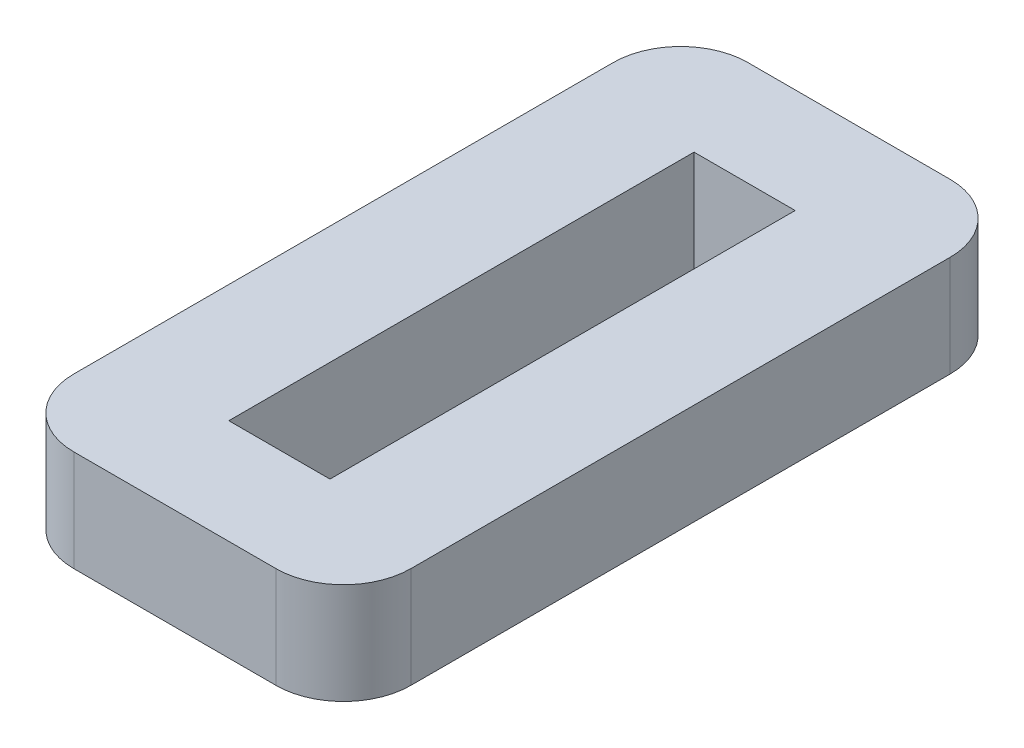
ISO-10303-21;
HEADER;
FILE_DESCRIPTION(('STEP AP214'),'2;1');
FILE_NAME('part.step','',(''),(''),'','','');
FILE_SCHEMA(('AUTOMOTIVE_DESIGN { 1 0 10303 214 1 1 1 1 }'));
ENDSEC;
DATA;
#1=APPLICATION_CONTEXT('core data for automotive mechanical design processes');
#2=APPLICATION_PROTOCOL_DEFINITION('international standard','automotive_design',2000,#1);
#3=PRODUCT_CONTEXT('',#1,'mechanical');
#4=PRODUCT('Part','Part','',(#3));
#5=PRODUCT_RELATED_PRODUCT_CATEGORY('part','',(#4));
#6=PRODUCT_DEFINITION_FORMATION('','',#4);
#7=PRODUCT_DEFINITION_CONTEXT('part definition',#1,'design');
#8=PRODUCT_DEFINITION('design','',#6,#7);
#9=PRODUCT_DEFINITION_SHAPE('','',#8);
#10=(LENGTH_UNIT() NAMED_UNIT(*) SI_UNIT(.MILLI.,.METRE.));
#11=(NAMED_UNIT(*) PLANE_ANGLE_UNIT() SI_UNIT($,.RADIAN.));
#12=(NAMED_UNIT(*) SI_UNIT($,.STERADIAN.) SOLID_ANGLE_UNIT());
#13=UNCERTAINTY_MEASURE_WITH_UNIT(LENGTH_MEASURE(1.E-05),#10,'distance_accuracy_value','');
#14=(GEOMETRIC_REPRESENTATION_CONTEXT(3) GLOBAL_UNCERTAINTY_ASSIGNED_CONTEXT((#13)) GLOBAL_UNIT_ASSIGNED_CONTEXT((#10,
#11,#12)) REPRESENTATION_CONTEXT('',''));
#15=CARTESIAN_POINT('',(0.,0.,0.));
#16=DIRECTION('',(0.,0.,1.));
#17=DIRECTION('',(1.,0.,0.));
#18=AXIS2_PLACEMENT_3D('',#15,#16,#17);
#19=CARTESIAN_POINT('',(5.,3.,10.));
#20=DIRECTION('',(-1.,0.,0.));
#21=DIRECTION('',(0.,0.,1.));
#22=AXIS2_PLACEMENT_3D('',#19,#20,#21);
#23=PLANE('',#22);
#24=DIRECTION('',(0.,0.,-1.));
#25=VECTOR('',#24,1.);
#26=CARTESIAN_POINT('',(5.,3.,10.));
#27=LINE('',#26,#25);
#28=CARTESIAN_POINT('',(5.,3.,8.));
#29=VERTEX_POINT('',#28);
#30=CARTESIAN_POINT('',(5.,3.,-8.));
#31=VERTEX_POINT('',#30);
#32=EDGE_CURVE('E170',#29,#31,#27,.T.);
#33=ORIENTED_EDGE('',*,*,#32,.F.);
#34=DIRECTION('',(0.,-1.,0.));
#35=VECTOR('',#34,1.);
#36=CARTESIAN_POINT('',(5.,3.,8.));
#37=LINE('',#36,#35);
#38=CARTESIAN_POINT('',(5.,0.,8.));
#39=VERTEX_POINT('',#38);
#40=EDGE_CURVE('E217',#29,#39,#37,.T.);
#41=ORIENTED_EDGE('',*,*,#40,.T.);
#42=DIRECTION('',(0.,0.,-1.));
#43=VECTOR('',#42,1.);
#44=CARTESIAN_POINT('',(5.,0.,10.));
#45=LINE('',#44,#43);
#46=CARTESIAN_POINT('',(5.,0.,-8.));
#47=VERTEX_POINT('',#46);
#48=EDGE_CURVE('E166',#39,#47,#45,.T.);
#49=ORIENTED_EDGE('',*,*,#48,.T.);
#50=DIRECTION('',(0.,-1.,0.));
#51=VECTOR('',#50,1.);
#52=CARTESIAN_POINT('',(5.,3.,-8.));
#53=LINE('',#52,#51);
#54=EDGE_CURVE('E215',#47,#31,#53,.F.);
#55=ORIENTED_EDGE('',*,*,#54,.T.);
#56=EDGE_LOOP('',(#33,#41,#49,#55));
#57=FACE_BOUND('',#56,.T.);
#58=ADVANCED_FACE('F36',(#57),#23,.F.);
#59=CARTESIAN_POINT('',(-5.,3.,-10.));
#60=DIRECTION('',(0.,0.,1.));
#61=DIRECTION('',(1.,0.,0.));
#62=AXIS2_PLACEMENT_3D('',#59,#60,#61);
#63=PLANE('',#62);
#64=DIRECTION('',(-1.,0.,0.));
#65=VECTOR('',#64,1.);
#66=CARTESIAN_POINT('',(-5.,3.,-10.));
#67=LINE('',#66,#65);
#68=CARTESIAN_POINT('',(3.,3.,-10.));
#69=VERTEX_POINT('',#68);
#70=CARTESIAN_POINT('',(-3.,3.,-10.));
#71=VERTEX_POINT('',#70);
#72=EDGE_CURVE('E172',#69,#71,#67,.T.);
#73=ORIENTED_EDGE('',*,*,#72,.F.);
#74=DIRECTION('',(0.,-1.,0.));
#75=VECTOR('',#74,1.);
#76=CARTESIAN_POINT('',(3.,3.,-10.));
#77=LINE('',#76,#75);
#78=CARTESIAN_POINT('',(3.,0.,-10.));
#79=VERTEX_POINT('',#78);
#80=EDGE_CURVE('E11',#69,#79,#77,.T.);
#81=ORIENTED_EDGE('',*,*,#80,.T.);
#82=DIRECTION('',(-1.,0.,0.));
#83=VECTOR('',#82,1.);
#84=CARTESIAN_POINT('',(-5.,0.,-10.));
#85=LINE('',#84,#83);
#86=CARTESIAN_POINT('',(-3.,0.,-10.));
#87=VERTEX_POINT('',#86);
#88=EDGE_CURVE('E184',#79,#87,#85,.T.);
#89=ORIENTED_EDGE('',*,*,#88,.T.);
#90=DIRECTION('',(0.,-1.,0.));
#91=VECTOR('',#90,1.);
#92=CARTESIAN_POINT('',(-3.,3.,-10.));
#93=LINE('',#92,#91);
#94=EDGE_CURVE('E44',#87,#71,#93,.F.);
#95=ORIENTED_EDGE('',*,*,#94,.T.);
#96=EDGE_LOOP('',(#73,#81,#89,#95));
#97=FACE_BOUND('',#96,.T.);
#98=ADVANCED_FACE('F231',(#97),#63,.F.);
#99=CARTESIAN_POINT('',(-5.,3.,10.));
#100=DIRECTION('',(1.,0.,0.));
#101=DIRECTION('',(0.,0.,-1.));
#102=AXIS2_PLACEMENT_3D('',#99,#100,#101);
#103=PLANE('',#102);
#104=DIRECTION('',(0.,0.,1.));
#105=VECTOR('',#104,1.);
#106=CARTESIAN_POINT('',(-5.,0.,10.));
#107=LINE('',#106,#105);
#108=CARTESIAN_POINT('',(-5.,0.,-8.));
#109=VERTEX_POINT('',#108);
#110=CARTESIAN_POINT('',(-5.,0.,8.));
#111=VERTEX_POINT('',#110);
#112=EDGE_CURVE('E186',#109,#111,#107,.T.);
#113=ORIENTED_EDGE('',*,*,#112,.T.);
#114=DIRECTION('',(0.,-1.,0.));
#115=VECTOR('',#114,1.);
#116=CARTESIAN_POINT('',(-5.,3.,8.));
#117=LINE('',#116,#115);
#118=CARTESIAN_POINT('',(-5.,3.,8.));
#119=VERTEX_POINT('',#118);
#120=EDGE_CURVE('E206',#111,#119,#117,.F.);
#121=ORIENTED_EDGE('',*,*,#120,.T.);
#122=DIRECTION('',(0.,0.,1.));
#123=VECTOR('',#122,1.);
#124=CARTESIAN_POINT('',(-5.,3.,10.));
#125=LINE('',#124,#123);
#126=CARTESIAN_POINT('',(-5.,3.,-8.));
#127=VERTEX_POINT('',#126);
#128=EDGE_CURVE('E175',#127,#119,#125,.T.);
#129=ORIENTED_EDGE('',*,*,#128,.F.);
#130=DIRECTION('',(0.,-1.,0.));
#131=VECTOR('',#130,1.);
#132=CARTESIAN_POINT('',(-5.,3.,-8.));
#133=LINE('',#132,#131);
#134=EDGE_CURVE('E203',#127,#109,#133,.T.);
#135=ORIENTED_EDGE('',*,*,#134,.T.);
#136=EDGE_LOOP('',(#113,#121,#129,#135));
#137=FACE_BOUND('',#136,.T.);
#138=ADVANCED_FACE('F239',(#137),#103,.F.);
#139=CARTESIAN_POINT('',(-5.,3.,10.));
#140=DIRECTION('',(0.,0.,-1.));
#141=DIRECTION('',(-1.,0.,0.));
#142=AXIS2_PLACEMENT_3D('',#139,#140,#141);
#143=PLANE('',#142);
#144=DIRECTION('',(1.,0.,0.));
#145=VECTOR('',#144,1.);
#146=CARTESIAN_POINT('',(-5.,3.,10.));
#147=LINE('',#146,#145);
#148=CARTESIAN_POINT('',(-3.,3.,10.));
#149=VERTEX_POINT('',#148);
#150=CARTESIAN_POINT('',(3.,3.,10.));
#151=VERTEX_POINT('',#150);
#152=EDGE_CURVE('E178',#149,#151,#147,.T.);
#153=ORIENTED_EDGE('',*,*,#152,.F.);
#154=DIRECTION('',(0.,-1.,0.));
#155=VECTOR('',#154,1.);
#156=CARTESIAN_POINT('',(-3.,3.,10.));
#157=LINE('',#156,#155);
#158=CARTESIAN_POINT('',(-3.,0.,10.));
#159=VERTEX_POINT('',#158);
#160=EDGE_CURVE('E192',#149,#159,#157,.T.);
#161=ORIENTED_EDGE('',*,*,#160,.T.);
#162=DIRECTION('',(1.,0.,0.));
#163=VECTOR('',#162,1.);
#164=CARTESIAN_POINT('',(-5.,0.,10.));
#165=LINE('',#164,#163);
#166=CARTESIAN_POINT('',(3.,0.,10.));
#167=VERTEX_POINT('',#166);
#168=EDGE_CURVE('E173',#159,#167,#165,.T.);
#169=ORIENTED_EDGE('',*,*,#168,.T.);
#170=DIRECTION('',(0.,-1.,0.));
#171=VECTOR('',#170,1.);
#172=CARTESIAN_POINT('',(3.,3.,10.));
#173=LINE('',#172,#171);
#174=EDGE_CURVE('E181',#167,#151,#173,.F.);
#175=ORIENTED_EDGE('',*,*,#174,.T.);
#176=EDGE_LOOP('',(#153,#161,#169,#175));
#177=FACE_BOUND('',#176,.T.);
#178=ADVANCED_FACE('F247',(#177),#143,.F.);
#179=CARTESIAN_POINT('',(0.,3.,0.));
#180=DIRECTION('',(0.,-1.,0.));
#181=DIRECTION('',(0.,0.,-1.));
#182=AXIS2_PLACEMENT_3D('',#179,#180,#181);
#183=PLANE('',#182);
#184=DIRECTION('',(-1.,0.,0.));
#185=VECTOR('',#184,1.);
#186=CARTESIAN_POINT('',(-1.5,3.,-6.9));
#187=LINE('',#186,#185);
#188=CARTESIAN_POINT('',(1.5,3.,-6.9));
#189=VERTEX_POINT('',#188);
#190=CARTESIAN_POINT('',(-1.5,3.,-6.9));
#191=VERTEX_POINT('',#190);
#192=EDGE_CURVE('E160',#189,#191,#187,.T.);
#193=ORIENTED_EDGE('',*,*,#192,.F.);
#194=DIRECTION('',(0.,0.,-1.));
#195=VECTOR('',#194,1.);
#196=CARTESIAN_POINT('',(1.5,3.,6.9));
#197=LINE('',#196,#195);
#198=CARTESIAN_POINT('',(1.5,3.,6.9));
#199=VERTEX_POINT('',#198);
#200=EDGE_CURVE('E133',#199,#189,#197,.T.);
#201=ORIENTED_EDGE('',*,*,#200,.F.);
#202=DIRECTION('',(1.,0.,0.));
#203=VECTOR('',#202,1.);
#204=CARTESIAN_POINT('',(-1.5,3.,6.9));
#205=LINE('',#204,#203);
#206=CARTESIAN_POINT('',(-1.5,3.,6.9));
#207=VERTEX_POINT('',#206);
#208=EDGE_CURVE('E151',#207,#199,#205,.T.);
#209=ORIENTED_EDGE('',*,*,#208,.F.);
#210=DIRECTION('',(0.,0.,1.));
#211=VECTOR('',#210,1.);
#212=CARTESIAN_POINT('',(-1.5,3.,6.9));
#213=LINE('',#212,#211);
#214=EDGE_CURVE('E154',#191,#207,#213,.T.);
#215=ORIENTED_EDGE('',*,*,#214,.F.);
#216=EDGE_LOOP('',(#193,#201,#209,#215));
#217=FACE_BOUND('',#216,.T.);
#218=ORIENTED_EDGE('',*,*,#128,.T.);
#219=CARTESIAN_POINT('',(-3.,3.,8.));
#220=DIRECTION('',(0.,-1.,0.));
#221=DIRECTION('',(0.,0.,-1.));
#222=AXIS2_PLACEMENT_3D('',#219,#220,#221);
#223=CIRCLE('',#222,2.);
#224=EDGE_CURVE('E213',#119,#149,#223,.F.);
#225=ORIENTED_EDGE('',*,*,#224,.T.);
#226=ORIENTED_EDGE('',*,*,#152,.T.);
#227=CARTESIAN_POINT('',(3.,3.,8.));
#228=DIRECTION('',(0.,-1.,0.));
#229=DIRECTION('',(0.,0.,-1.));
#230=AXIS2_PLACEMENT_3D('',#227,#228,#229);
#231=CIRCLE('',#230,2.);
#232=EDGE_CURVE('E211',#151,#29,#231,.F.);
#233=ORIENTED_EDGE('',*,*,#232,.T.);
#234=ORIENTED_EDGE('',*,*,#32,.T.);
#235=CARTESIAN_POINT('',(3.,3.,-8.));
#236=DIRECTION('',(0.,-1.,0.));
#237=DIRECTION('',(0.,0.,-1.));
#238=AXIS2_PLACEMENT_3D('',#235,#236,#237);
#239=CIRCLE('',#238,2.);
#240=EDGE_CURVE('E57',#31,#69,#239,.F.);
#241=ORIENTED_EDGE('',*,*,#240,.T.);
#242=ORIENTED_EDGE('',*,*,#72,.T.);
#243=CARTESIAN_POINT('',(-3.,3.,-8.));
#244=DIRECTION('',(0.,-1.,0.));
#245=DIRECTION('',(0.,0.,-1.));
#246=AXIS2_PLACEMENT_3D('',#243,#244,#245);
#247=CIRCLE('',#246,2.);
#248=EDGE_CURVE('E208',#71,#127,#247,.F.);
#249=ORIENTED_EDGE('',*,*,#248,.T.);
#250=EDGE_LOOP('',(#218,#225,#226,#233,#234,#241,#242,#249));
#251=FACE_BOUND('',#250,.T.);
#252=ADVANCED_FACE('F233',(#217,#251),#183,.F.);
#253=CARTESIAN_POINT('',(0.,0.,0.));
#254=DIRECTION('',(0.,-1.,0.));
#255=DIRECTION('',(0.,0.,-1.));
#256=AXIS2_PLACEMENT_3D('',#253,#254,#255);
#257=PLANE('',#256);
#258=DIRECTION('',(0.,0.,-1.));
#259=VECTOR('',#258,1.);
#260=CARTESIAN_POINT('',(1.5,0.,6.9));
#261=LINE('',#260,#259);
#262=CARTESIAN_POINT('',(1.5,0.,6.9));
#263=VERTEX_POINT('',#262);
#264=CARTESIAN_POINT('',(1.5,0.,-6.9));
#265=VERTEX_POINT('',#264);
#266=EDGE_CURVE('E130',#263,#265,#261,.T.);
#267=ORIENTED_EDGE('',*,*,#266,.T.);
#268=DIRECTION('',(-1.,0.,0.));
#269=VECTOR('',#268,1.);
#270=CARTESIAN_POINT('',(-1.5,0.,-6.9));
#271=LINE('',#270,#269);
#272=CARTESIAN_POINT('',(-1.5,0.,-6.9));
#273=VERTEX_POINT('',#272);
#274=EDGE_CURVE('E142',#265,#273,#271,.T.);
#275=ORIENTED_EDGE('',*,*,#274,.T.);
#276=DIRECTION('',(0.,0.,1.));
#277=VECTOR('',#276,1.);
#278=CARTESIAN_POINT('',(-1.5,0.,6.9));
#279=LINE('',#278,#277);
#280=CARTESIAN_POINT('',(-1.5,0.,6.9));
#281=VERTEX_POINT('',#280);
#282=EDGE_CURVE('E146',#273,#281,#279,.T.);
#283=ORIENTED_EDGE('',*,*,#282,.T.);
#284=DIRECTION('',(1.,0.,0.));
#285=VECTOR('',#284,1.);
#286=CARTESIAN_POINT('',(-1.5,0.,6.9));
#287=LINE('',#286,#285);
#288=EDGE_CURVE('E138',#281,#263,#287,.T.);
#289=ORIENTED_EDGE('',*,*,#288,.T.);
#290=EDGE_LOOP('',(#267,#275,#283,#289));
#291=FACE_BOUND('',#290,.T.);
#292=ORIENTED_EDGE('',*,*,#168,.F.);
#293=CARTESIAN_POINT('',(-3.,0.,8.));
#294=DIRECTION('',(0.,-1.,0.));
#295=DIRECTION('',(0.,0.,-1.));
#296=AXIS2_PLACEMENT_3D('',#293,#294,#295);
#297=CIRCLE('',#296,2.);
#298=EDGE_CURVE('E201',#159,#111,#297,.T.);
#299=ORIENTED_EDGE('',*,*,#298,.T.);
#300=ORIENTED_EDGE('',*,*,#112,.F.);
#301=CARTESIAN_POINT('',(-3.,0.,-8.));
#302=DIRECTION('',(0.,-1.,0.));
#303=DIRECTION('',(0.,0.,-1.));
#304=AXIS2_PLACEMENT_3D('',#301,#302,#303);
#305=CIRCLE('',#304,2.);
#306=EDGE_CURVE('E195',#109,#87,#305,.T.);
#307=ORIENTED_EDGE('',*,*,#306,.T.);
#308=ORIENTED_EDGE('',*,*,#88,.F.);
#309=CARTESIAN_POINT('',(3.,0.,-8.));
#310=DIRECTION('',(0.,-1.,0.));
#311=DIRECTION('',(0.,0.,-1.));
#312=AXIS2_PLACEMENT_3D('',#309,#310,#311);
#313=CIRCLE('',#312,2.);
#314=EDGE_CURVE('E197',#79,#47,#313,.T.);
#315=ORIENTED_EDGE('',*,*,#314,.T.);
#316=ORIENTED_EDGE('',*,*,#48,.F.);
#317=CARTESIAN_POINT('',(3.,0.,8.));
#318=DIRECTION('',(0.,-1.,0.));
#319=DIRECTION('',(0.,0.,-1.));
#320=AXIS2_PLACEMENT_3D('',#317,#318,#319);
#321=CIRCLE('',#320,2.);
#322=EDGE_CURVE('E199',#39,#167,#321,.T.);
#323=ORIENTED_EDGE('',*,*,#322,.T.);
#324=EDGE_LOOP('',(#292,#299,#300,#307,#308,#315,#316,#323));
#325=FACE_BOUND('',#324,.T.);
#326=ADVANCED_FACE('F148',(#291,#325),#257,.T.);
#327=CARTESIAN_POINT('',(1.5,0.,6.9));
#328=DIRECTION('',(1.,0.,0.));
#329=DIRECTION('',(0.,0.,-1.));
#330=AXIS2_PLACEMENT_3D('',#327,#328,#329);
#331=PLANE('',#330);
#332=ORIENTED_EDGE('',*,*,#200,.T.);
#333=DIRECTION('',(0.,1.,0.));
#334=VECTOR('',#333,1.);
#335=CARTESIAN_POINT('',(1.5,0.,-6.9));
#336=LINE('',#335,#334);
#337=EDGE_CURVE('E126',#265,#189,#336,.T.);
#338=ORIENTED_EDGE('',*,*,#337,.F.);
#339=ORIENTED_EDGE('',*,*,#266,.F.);
#340=DIRECTION('',(0.,1.,0.));
#341=VECTOR('',#340,1.);
#342=CARTESIAN_POINT('',(1.5,0.,6.9));
#343=LINE('',#342,#341);
#344=EDGE_CURVE('E164',#263,#199,#343,.T.);
#345=ORIENTED_EDGE('',*,*,#344,.T.);
#346=EDGE_LOOP('',(#332,#338,#339,#345));
#347=FACE_BOUND('',#346,.T.);
#348=ADVANCED_FACE('F128',(#347),#331,.F.);
#349=CARTESIAN_POINT('',(-1.5,0.,6.9));
#350=DIRECTION('',(0.,0.,1.));
#351=DIRECTION('',(1.,0.,0.));
#352=AXIS2_PLACEMENT_3D('',#349,#350,#351);
#353=PLANE('',#352);
#354=ORIENTED_EDGE('',*,*,#208,.T.);
#355=ORIENTED_EDGE('',*,*,#344,.F.);
#356=ORIENTED_EDGE('',*,*,#288,.F.);
#357=DIRECTION('',(0.,1.,0.));
#358=VECTOR('',#357,1.);
#359=CARTESIAN_POINT('',(-1.5,0.,6.9));
#360=LINE('',#359,#358);
#361=EDGE_CURVE('E167',#281,#207,#360,.T.);
#362=ORIENTED_EDGE('',*,*,#361,.T.);
#363=EDGE_LOOP('',(#354,#355,#356,#362));
#364=FACE_BOUND('',#363,.T.);
#365=ADVANCED_FACE('F275',(#364),#353,.F.);
#366=CARTESIAN_POINT('',(-1.5,0.,6.9));
#367=DIRECTION('',(-1.,0.,0.));
#368=DIRECTION('',(0.,0.,1.));
#369=AXIS2_PLACEMENT_3D('',#366,#367,#368);
#370=PLANE('',#369);
#371=ORIENTED_EDGE('',*,*,#214,.T.);
#372=ORIENTED_EDGE('',*,*,#361,.F.);
#373=ORIENTED_EDGE('',*,*,#282,.F.);
#374=DIRECTION('',(0.,1.,0.));
#375=VECTOR('',#374,1.);
#376=CARTESIAN_POINT('',(-1.5,0.,-6.9));
#377=LINE('',#376,#375);
#378=EDGE_CURVE('E137',#273,#191,#377,.T.);
#379=ORIENTED_EDGE('',*,*,#378,.T.);
#380=EDGE_LOOP('',(#371,#372,#373,#379));
#381=FACE_BOUND('',#380,.T.);
#382=ADVANCED_FACE('F278',(#381),#370,.F.);
#383=CARTESIAN_POINT('',(-1.5,0.,-6.9));
#384=DIRECTION('',(0.,0.,-1.));
#385=DIRECTION('',(-1.,0.,0.));
#386=AXIS2_PLACEMENT_3D('',#383,#384,#385);
#387=PLANE('',#386);
#388=ORIENTED_EDGE('',*,*,#192,.T.);
#389=ORIENTED_EDGE('',*,*,#378,.F.);
#390=ORIENTED_EDGE('',*,*,#274,.F.);
#391=ORIENTED_EDGE('',*,*,#337,.T.);
#392=EDGE_LOOP('',(#388,#389,#390,#391));
#393=FACE_BOUND('',#392,.T.);
#394=ADVANCED_FACE('F143',(#393),#387,.F.);
#395=CARTESIAN_POINT('',(-3.,3.,8.));
#396=DIRECTION('',(0.,-1.,0.));
#397=DIRECTION('',(0.,0.,-1.));
#398=AXIS2_PLACEMENT_3D('',#395,#396,#397);
#399=CYLINDRICAL_SURFACE('',#398,2.);
#400=ORIENTED_EDGE('',*,*,#224,.F.);
#401=ORIENTED_EDGE('',*,*,#120,.F.);
#402=ORIENTED_EDGE('',*,*,#298,.F.);
#403=ORIENTED_EDGE('',*,*,#160,.F.);
#404=EDGE_LOOP('',(#400,#401,#402,#403));
#405=FACE_BOUND('',#404,.T.);
#406=ADVANCED_FACE('F244',(#405),#399,.T.);
#407=CARTESIAN_POINT('',(3.,3.,8.));
#408=DIRECTION('',(0.,-1.,0.));
#409=DIRECTION('',(0.,0.,-1.));
#410=AXIS2_PLACEMENT_3D('',#407,#408,#409);
#411=CYLINDRICAL_SURFACE('',#410,2.);
#412=ORIENTED_EDGE('',*,*,#232,.F.);
#413=ORIENTED_EDGE('',*,*,#174,.F.);
#414=ORIENTED_EDGE('',*,*,#322,.F.);
#415=ORIENTED_EDGE('',*,*,#40,.F.);
#416=EDGE_LOOP('',(#412,#413,#414,#415));
#417=FACE_BOUND('',#416,.T.);
#418=ADVANCED_FACE('F249',(#417),#411,.T.);
#419=CARTESIAN_POINT('',(3.,3.,-8.));
#420=DIRECTION('',(0.,-1.,0.));
#421=DIRECTION('',(0.,0.,-1.));
#422=AXIS2_PLACEMENT_3D('',#419,#420,#421);
#423=CYLINDRICAL_SURFACE('',#422,2.);
#424=ORIENTED_EDGE('',*,*,#240,.F.);
#425=ORIENTED_EDGE('',*,*,#54,.F.);
#426=ORIENTED_EDGE('',*,*,#314,.F.);
#427=ORIENTED_EDGE('',*,*,#80,.F.);
#428=EDGE_LOOP('',(#424,#425,#426,#427));
#429=FACE_BOUND('',#428,.T.);
#430=ADVANCED_FACE('F230',(#429),#423,.T.);
#431=CARTESIAN_POINT('',(-3.,3.,-8.));
#432=DIRECTION('',(0.,-1.,0.));
#433=DIRECTION('',(0.,0.,-1.));
#434=AXIS2_PLACEMENT_3D('',#431,#432,#433);
#435=CYLINDRICAL_SURFACE('',#434,2.);
#436=ORIENTED_EDGE('',*,*,#248,.F.);
#437=ORIENTED_EDGE('',*,*,#94,.F.);
#438=ORIENTED_EDGE('',*,*,#306,.F.);
#439=ORIENTED_EDGE('',*,*,#134,.F.);
#440=EDGE_LOOP('',(#436,#437,#438,#439));
#441=FACE_BOUND('',#440,.T.);
#442=ADVANCED_FACE('F38',(#441),#435,.T.);
#443=CLOSED_SHELL('',(#58,#98,#138,#178,#252,#326,#348,#365,#382,#394,#406,#418,#430,#442));
#444=MANIFOLD_SOLID_BREP('B2',#443);
#445=ADVANCED_BREP_SHAPE_REPRESENTATION('',(#18,#444),#14);
#446=SHAPE_DEFINITION_REPRESENTATION(#9,#445);
ENDSEC;
END-ISO-10303-21;
